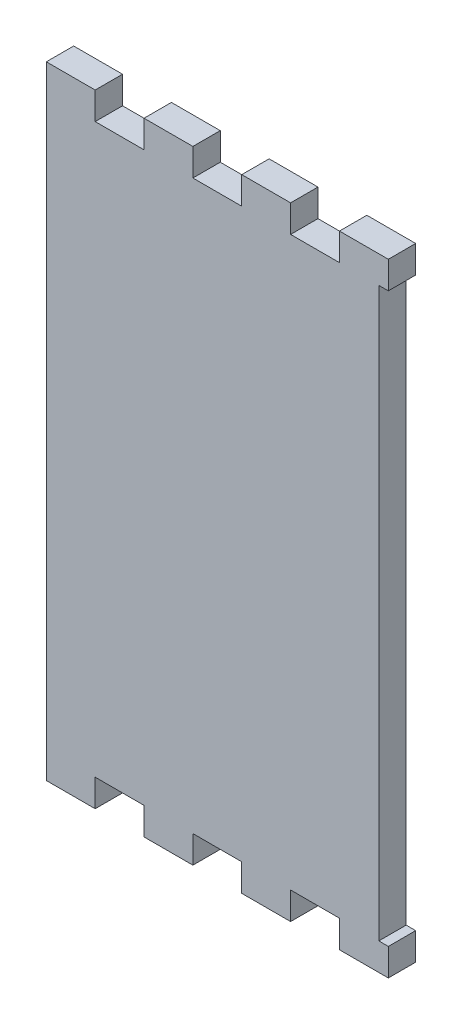
ISO-10303-21;
HEADER;
FILE_DESCRIPTION(('STEP AP214'),'2;1');
FILE_NAME('part.step','',(''),(''),'','','');
FILE_SCHEMA(('AUTOMOTIVE_DESIGN { 1 0 10303 214 1 1 1 1 }'));
ENDSEC;
DATA;
#1=APPLICATION_CONTEXT('core data for automotive mechanical design processes');
#2=APPLICATION_PROTOCOL_DEFINITION('international standard','automotive_design',2000,#1);
#3=PRODUCT_CONTEXT('',#1,'mechanical');
#4=PRODUCT('Part','Part','',(#3));
#5=PRODUCT_RELATED_PRODUCT_CATEGORY('part','',(#4));
#6=PRODUCT_DEFINITION_FORMATION('','',#4);
#7=PRODUCT_DEFINITION_CONTEXT('part definition',#1,'design');
#8=PRODUCT_DEFINITION('design','',#6,#7);
#9=PRODUCT_DEFINITION_SHAPE('','',#8);
#10=(LENGTH_UNIT() NAMED_UNIT(*) SI_UNIT(.MILLI.,.METRE.));
#11=(NAMED_UNIT(*) PLANE_ANGLE_UNIT() SI_UNIT($,.RADIAN.));
#12=(NAMED_UNIT(*) SI_UNIT($,.STERADIAN.) SOLID_ANGLE_UNIT());
#13=UNCERTAINTY_MEASURE_WITH_UNIT(LENGTH_MEASURE(1.E-05),#10,'distance_accuracy_value','');
#14=(GEOMETRIC_REPRESENTATION_CONTEXT(3) GLOBAL_UNCERTAINTY_ASSIGNED_CONTEXT((#13)) GLOBAL_UNIT_ASSIGNED_CONTEXT((#10,
#11,#12)) REPRESENTATION_CONTEXT('',''));
#15=CARTESIAN_POINT('',(0.,0.,0.));
#16=DIRECTION('',(0.,0.,1.));
#17=DIRECTION('',(1.,0.,0.));
#18=AXIS2_PLACEMENT_3D('',#15,#16,#17);
#19=CARTESIAN_POINT('',(61.2512678289989,12.8931544247676,-71.1104050028956));
#20=DIRECTION('',(1.,0.,0.));
#21=DIRECTION('',(0.,0.,-1.));
#22=AXIS2_PLACEMENT_3D('',#19,#20,#21);
#23=PLANE('',#22);
#24=DIRECTION('',(0.,-1.,0.));
#25=VECTOR('',#24,1.);
#26=CARTESIAN_POINT('',(61.2512678289989,12.8931544247676,-76.7104050028956));
#27=LINE('',#26,#25);
#28=CARTESIAN_POINT('',(61.2512678289989,134.693154424768,-76.7104050028956));
#29=VERTEX_POINT('',#28);
#30=CARTESIAN_POINT('',(61.2512678289989,7.29315442476763,-76.7104050028956));
#31=VERTEX_POINT('',#30);
#32=EDGE_CURVE('E157',#29,#31,#27,.T.);
#33=ORIENTED_EDGE('',*,*,#32,.T.);
#34=DIRECTION('',(0.,0.,-1.));
#35=VECTOR('',#34,1.);
#36=CARTESIAN_POINT('',(61.2512678289989,7.29315442476763,-71.1104050028956));
#37=LINE('',#36,#35);
#38=CARTESIAN_POINT('',(61.2512678289989,7.29315442476763,-71.1104050028956));
#39=VERTEX_POINT('',#38);
#40=EDGE_CURVE('E11',#39,#31,#37,.T.);
#41=ORIENTED_EDGE('',*,*,#40,.F.);
#42=DIRECTION('',(0.,-1.,0.));
#43=VECTOR('',#42,1.);
#44=CARTESIAN_POINT('',(61.2512678289989,134.693154424768,-71.1104050028956));
#45=LINE('',#44,#43);
#46=CARTESIAN_POINT('',(61.2512678289989,134.693154424768,-71.1104050028956));
#47=VERTEX_POINT('',#46);
#48=EDGE_CURVE('E163',#47,#39,#45,.T.);
#49=ORIENTED_EDGE('',*,*,#48,.F.);
#50=DIRECTION('',(0.,0.,-1.));
#51=VECTOR('',#50,1.);
#52=CARTESIAN_POINT('',(61.2512678289989,134.693154424768,-71.1104050028956));
#53=LINE('',#52,#51);
#54=EDGE_CURVE('E269',#47,#29,#53,.T.);
#55=ORIENTED_EDGE('',*,*,#54,.T.);
#56=EDGE_LOOP('',(#33,#41,#49,#55));
#57=FACE_BOUND('',#56,.T.);
#58=ADVANCED_FACE('F33',(#57),#23,.F.);
#59=CARTESIAN_POINT('',(61.2512678289989,7.29315442476763,-71.1104050028956));
#60=DIRECTION('',(0.,1.,0.));
#61=DIRECTION('',(0.,0.,1.));
#62=AXIS2_PLACEMENT_3D('',#59,#60,#61);
#63=PLANE('',#62);
#64=DIRECTION('',(1.,0.,0.));
#65=VECTOR('',#64,1.);
#66=CARTESIAN_POINT('',(61.2512678289989,7.29315442476763,-76.7104050028956));
#67=LINE('',#66,#65);
#68=CARTESIAN_POINT('',(71.2512678289989,7.29315442476763,-76.7104050028956));
#69=VERTEX_POINT('',#68);
#70=EDGE_CURVE('E274',#31,#69,#67,.T.);
#71=ORIENTED_EDGE('',*,*,#70,.T.);
#72=DIRECTION('',(0.,0.,-1.));
#73=VECTOR('',#72,1.);
#74=CARTESIAN_POINT('',(71.2512678289989,7.29315442476763,-71.1104050028956));
#75=LINE('',#74,#73);
#76=CARTESIAN_POINT('',(71.2512678289989,7.29315442476763,-71.1104050028956));
#77=VERTEX_POINT('',#76);
#78=EDGE_CURVE('E41',#77,#69,#75,.T.);
#79=ORIENTED_EDGE('',*,*,#78,.F.);
#80=DIRECTION('',(1.,0.,0.));
#81=VECTOR('',#80,1.);
#82=CARTESIAN_POINT('',(61.2512678289989,7.29315442476763,-71.1104050028956));
#83=LINE('',#82,#81);
#84=EDGE_CURVE('E502',#39,#77,#83,.T.);
#85=ORIENTED_EDGE('',*,*,#84,.F.);
#86=ORIENTED_EDGE('',*,*,#40,.T.);
#87=EDGE_LOOP('',(#71,#79,#85,#86));
#88=FACE_BOUND('',#87,.T.);
#89=ADVANCED_FACE('F505',(#88),#63,.F.);
#90=CARTESIAN_POINT('',(71.2512678289989,7.29315442476763,-71.1104050028956));
#91=DIRECTION('',(-1.,0.,0.));
#92=DIRECTION('',(0.,0.,1.));
#93=AXIS2_PLACEMENT_3D('',#90,#91,#92);
#94=PLANE('',#93);
#95=DIRECTION('',(0.,1.,0.));
#96=VECTOR('',#95,1.);
#97=CARTESIAN_POINT('',(71.2512678289989,7.29315442476763,-76.7104050028956));
#98=LINE('',#97,#96);
#99=CARTESIAN_POINT('',(71.2512678289989,12.8931544247676,-76.7104050028956));
#100=VERTEX_POINT('',#99);
#101=EDGE_CURVE('E276',#69,#100,#98,.T.);
#102=ORIENTED_EDGE('',*,*,#101,.T.);
#103=DIRECTION('',(0.,0.,-1.));
#104=VECTOR('',#103,1.);
#105=CARTESIAN_POINT('',(71.2512678289989,12.8931544247676,-71.1104050028956));
#106=LINE('',#105,#104);
#107=CARTESIAN_POINT('',(71.2512678289989,12.8931544247676,-71.1104050028956));
#108=VERTEX_POINT('',#107);
#109=EDGE_CURVE('E413',#108,#100,#106,.T.);
#110=ORIENTED_EDGE('',*,*,#109,.F.);
#111=DIRECTION('',(0.,1.,0.));
#112=VECTOR('',#111,1.);
#113=CARTESIAN_POINT('',(71.2512678289989,7.29315442476763,-71.1104050028956));
#114=LINE('',#113,#112);
#115=EDGE_CURVE('E422',#77,#108,#114,.T.);
#116=ORIENTED_EDGE('',*,*,#115,.F.);
#117=ORIENTED_EDGE('',*,*,#78,.T.);
#118=EDGE_LOOP('',(#102,#110,#116,#117));
#119=FACE_BOUND('',#118,.T.);
#120=ADVANCED_FACE('F420',(#119),#94,.F.);
#121=CARTESIAN_POINT('',(71.2512678289989,12.8931544247676,-71.1104050028956));
#122=DIRECTION('',(0.,1.,0.));
#123=DIRECTION('',(0.,0.,1.));
#124=AXIS2_PLACEMENT_3D('',#121,#122,#123);
#125=PLANE('',#124);
#126=DIRECTION('',(1.,0.,0.));
#127=VECTOR('',#126,1.);
#128=CARTESIAN_POINT('',(71.2512678289989,12.8931544247676,-76.7104050028956));
#129=LINE('',#128,#127);
#130=CARTESIAN_POINT('',(81.2512678289989,12.8931544247676,-76.7104050028956));
#131=VERTEX_POINT('',#130);
#132=EDGE_CURVE('E278',#100,#131,#129,.T.);
#133=ORIENTED_EDGE('',*,*,#132,.T.);
#134=DIRECTION('',(0.,0.,-1.));
#135=VECTOR('',#134,1.);
#136=CARTESIAN_POINT('',(81.2512678289989,12.8931544247676,-71.1104050028956));
#137=LINE('',#136,#135);
#138=CARTESIAN_POINT('',(81.2512678289989,12.8931544247676,-71.1104050028956));
#139=VERTEX_POINT('',#138);
#140=EDGE_CURVE('E410',#139,#131,#137,.T.);
#141=ORIENTED_EDGE('',*,*,#140,.F.);
#142=DIRECTION('',(1.,0.,0.));
#143=VECTOR('',#142,1.);
#144=CARTESIAN_POINT('',(71.2512678289989,12.8931544247676,-71.1104050028956));
#145=LINE('',#144,#143);
#146=EDGE_CURVE('E440',#108,#139,#145,.T.);
#147=ORIENTED_EDGE('',*,*,#146,.F.);
#148=ORIENTED_EDGE('',*,*,#109,.T.);
#149=EDGE_LOOP('',(#133,#141,#147,#148));
#150=FACE_BOUND('',#149,.T.);
#151=ADVANCED_FACE('F431',(#150),#125,.F.);
#152=CARTESIAN_POINT('',(81.2512678289989,12.8931544247676,-71.1104050028956));
#153=DIRECTION('',(1.,0.,0.));
#154=DIRECTION('',(0.,0.,-1.));
#155=AXIS2_PLACEMENT_3D('',#152,#153,#154);
#156=PLANE('',#155);
#157=DIRECTION('',(0.,-1.,0.));
#158=VECTOR('',#157,1.);
#159=CARTESIAN_POINT('',(81.2512678289989,12.8931544247676,-76.7104050028956));
#160=LINE('',#159,#158);
#161=CARTESIAN_POINT('',(81.2512678289989,7.29315442476763,-76.7104050028956));
#162=VERTEX_POINT('',#161);
#163=EDGE_CURVE('E280',#131,#162,#160,.T.);
#164=ORIENTED_EDGE('',*,*,#163,.T.);
#165=DIRECTION('',(0.,0.,-1.));
#166=VECTOR('',#165,1.);
#167=CARTESIAN_POINT('',(81.2512678289989,7.29315442476763,-71.1104050028956));
#168=LINE('',#167,#166);
#169=CARTESIAN_POINT('',(81.2512678289989,7.29315442476763,-71.1104050028956));
#170=VERTEX_POINT('',#169);
#171=EDGE_CURVE('E407',#170,#162,#168,.T.);
#172=ORIENTED_EDGE('',*,*,#171,.F.);
#173=DIRECTION('',(0.,-1.,0.));
#174=VECTOR('',#173,1.);
#175=CARTESIAN_POINT('',(81.2512678289989,12.8931544247676,-71.1104050028956));
#176=LINE('',#175,#174);
#177=EDGE_CURVE('E437',#139,#170,#176,.T.);
#178=ORIENTED_EDGE('',*,*,#177,.F.);
#179=ORIENTED_EDGE('',*,*,#140,.T.);
#180=EDGE_LOOP('',(#164,#172,#178,#179));
#181=FACE_BOUND('',#180,.T.);
#182=ADVANCED_FACE('F435',(#181),#156,.F.);
#183=CARTESIAN_POINT('',(81.2512678289989,7.29315442476763,-71.1104050028956));
#184=DIRECTION('',(0.,1.,0.));
#185=DIRECTION('',(0.,0.,1.));
#186=AXIS2_PLACEMENT_3D('',#183,#184,#185);
#187=PLANE('',#186);
#188=DIRECTION('',(1.,0.,0.));
#189=VECTOR('',#188,1.);
#190=CARTESIAN_POINT('',(81.2512678289989,7.29315442476763,-76.7104050028956));
#191=LINE('',#190,#189);
#192=CARTESIAN_POINT('',(91.2512678289989,7.29315442476763,-76.7104050028956));
#193=VERTEX_POINT('',#192);
#194=EDGE_CURVE('E282',#162,#193,#191,.T.);
#195=ORIENTED_EDGE('',*,*,#194,.T.);
#196=DIRECTION('',(0.,0.,-1.));
#197=VECTOR('',#196,1.);
#198=CARTESIAN_POINT('',(91.2512678289989,7.29315442476763,-71.1104050028956));
#199=LINE('',#198,#197);
#200=CARTESIAN_POINT('',(91.2512678289989,7.29315442476763,-71.1104050028956));
#201=VERTEX_POINT('',#200);
#202=EDGE_CURVE('E404',#201,#193,#199,.T.);
#203=ORIENTED_EDGE('',*,*,#202,.F.);
#204=DIRECTION('',(1.,0.,0.));
#205=VECTOR('',#204,1.);
#206=CARTESIAN_POINT('',(81.2512678289989,7.29315442476763,-71.1104050028956));
#207=LINE('',#206,#205);
#208=EDGE_CURVE('E439',#170,#201,#207,.T.);
#209=ORIENTED_EDGE('',*,*,#208,.F.);
#210=ORIENTED_EDGE('',*,*,#171,.T.);
#211=EDGE_LOOP('',(#195,#203,#209,#210));
#212=FACE_BOUND('',#211,.T.);
#213=ADVANCED_FACE('F517',(#212),#187,.F.);
#214=CARTESIAN_POINT('',(91.2512678289989,7.29315442476763,-71.1104050028956));
#215=DIRECTION('',(-1.,0.,0.));
#216=DIRECTION('',(0.,0.,1.));
#217=AXIS2_PLACEMENT_3D('',#214,#215,#216);
#218=PLANE('',#217);
#219=DIRECTION('',(0.,1.,0.));
#220=VECTOR('',#219,1.);
#221=CARTESIAN_POINT('',(91.2512678289989,7.29315442476763,-76.7104050028956));
#222=LINE('',#221,#220);
#223=CARTESIAN_POINT('',(91.2512678289989,12.8931544247676,-76.7104050028956));
#224=VERTEX_POINT('',#223);
#225=EDGE_CURVE('E284',#193,#224,#222,.T.);
#226=ORIENTED_EDGE('',*,*,#225,.T.);
#227=DIRECTION('',(0.,0.,-1.));
#228=VECTOR('',#227,1.);
#229=CARTESIAN_POINT('',(91.2512678289989,12.8931544247676,-71.1104050028956));
#230=LINE('',#229,#228);
#231=CARTESIAN_POINT('',(91.2512678289989,12.8931544247676,-71.1104050028956));
#232=VERTEX_POINT('',#231);
#233=EDGE_CURVE('E401',#232,#224,#230,.T.);
#234=ORIENTED_EDGE('',*,*,#233,.F.);
#235=DIRECTION('',(0.,1.,0.));
#236=VECTOR('',#235,1.);
#237=CARTESIAN_POINT('',(91.2512678289989,7.29315442476763,-71.1104050028956));
#238=LINE('',#237,#236);
#239=EDGE_CURVE('E442',#201,#232,#238,.T.);
#240=ORIENTED_EDGE('',*,*,#239,.F.);
#241=ORIENTED_EDGE('',*,*,#202,.T.);
#242=EDGE_LOOP('',(#226,#234,#240,#241));
#243=FACE_BOUND('',#242,.T.);
#244=ADVANCED_FACE('F520',(#243),#218,.F.);
#245=CARTESIAN_POINT('',(91.2512678289989,12.8931544247676,-71.1104050028956));
#246=DIRECTION('',(0.,1.,0.));
#247=DIRECTION('',(0.,0.,1.));
#248=AXIS2_PLACEMENT_3D('',#245,#246,#247);
#249=PLANE('',#248);
#250=DIRECTION('',(1.,0.,0.));
#251=VECTOR('',#250,1.);
#252=CARTESIAN_POINT('',(91.2512678289989,12.8931544247676,-76.7104050028956));
#253=LINE('',#252,#251);
#254=CARTESIAN_POINT('',(101.251267828999,12.8931544247676,-76.7104050028956));
#255=VERTEX_POINT('',#254);
#256=EDGE_CURVE('E286',#224,#255,#253,.T.);
#257=ORIENTED_EDGE('',*,*,#256,.T.);
#258=DIRECTION('',(0.,0.,-1.));
#259=VECTOR('',#258,1.);
#260=CARTESIAN_POINT('',(101.251267828999,12.8931544247676,-71.1104050028956));
#261=LINE('',#260,#259);
#262=CARTESIAN_POINT('',(101.251267828999,12.8931544247676,-71.1104050028956));
#263=VERTEX_POINT('',#262);
#264=EDGE_CURVE('E398',#263,#255,#261,.T.);
#265=ORIENTED_EDGE('',*,*,#264,.F.);
#266=DIRECTION('',(1.,0.,0.));
#267=VECTOR('',#266,1.);
#268=CARTESIAN_POINT('',(91.2512678289989,12.8931544247676,-71.1104050028956));
#269=LINE('',#268,#267);
#270=EDGE_CURVE('E448',#232,#263,#269,.T.);
#271=ORIENTED_EDGE('',*,*,#270,.F.);
#272=ORIENTED_EDGE('',*,*,#233,.T.);
#273=EDGE_LOOP('',(#257,#265,#271,#272));
#274=FACE_BOUND('',#273,.T.);
#275=ADVANCED_FACE('F524',(#274),#249,.F.);
#276=CARTESIAN_POINT('',(101.251267828999,12.8931544247676,-71.1104050028956));
#277=DIRECTION('',(1.,0.,0.));
#278=DIRECTION('',(0.,0.,-1.));
#279=AXIS2_PLACEMENT_3D('',#276,#277,#278);
#280=PLANE('',#279);
#281=DIRECTION('',(0.,-1.,0.));
#282=VECTOR('',#281,1.);
#283=CARTESIAN_POINT('',(101.251267828999,12.8931544247676,-76.7104050028956));
#284=LINE('',#283,#282);
#285=CARTESIAN_POINT('',(101.251267828999,7.29315442476763,-76.7104050028956));
#286=VERTEX_POINT('',#285);
#287=EDGE_CURVE('E288',#255,#286,#284,.T.);
#288=ORIENTED_EDGE('',*,*,#287,.T.);
#289=DIRECTION('',(0.,0.,-1.));
#290=VECTOR('',#289,1.);
#291=CARTESIAN_POINT('',(101.251267828999,7.29315442476763,-71.1104050028956));
#292=LINE('',#291,#290);
#293=CARTESIAN_POINT('',(101.251267828999,7.29315442476763,-71.1104050028956));
#294=VERTEX_POINT('',#293);
#295=EDGE_CURVE('E395',#294,#286,#292,.T.);
#296=ORIENTED_EDGE('',*,*,#295,.F.);
#297=DIRECTION('',(0.,-1.,0.));
#298=VECTOR('',#297,1.);
#299=CARTESIAN_POINT('',(101.251267828999,12.8931544247676,-71.1104050028956));
#300=LINE('',#299,#298);
#301=EDGE_CURVE('E450',#263,#294,#300,.T.);
#302=ORIENTED_EDGE('',*,*,#301,.F.);
#303=ORIENTED_EDGE('',*,*,#264,.T.);
#304=EDGE_LOOP('',(#288,#296,#302,#303));
#305=FACE_BOUND('',#304,.T.);
#306=ADVANCED_FACE('F528',(#305),#280,.F.);
#307=CARTESIAN_POINT('',(101.251267828999,7.29315442476763,-71.1104050028956));
#308=DIRECTION('',(0.,1.,0.));
#309=DIRECTION('',(0.,0.,1.));
#310=AXIS2_PLACEMENT_3D('',#307,#308,#309);
#311=PLANE('',#310);
#312=DIRECTION('',(1.,0.,0.));
#313=VECTOR('',#312,1.);
#314=CARTESIAN_POINT('',(101.251267828999,7.29315442476763,-76.7104050028956));
#315=LINE('',#314,#313);
#316=CARTESIAN_POINT('',(111.251267828999,7.29315442476763,-76.7104050028956));
#317=VERTEX_POINT('',#316);
#318=EDGE_CURVE('E290',#286,#317,#315,.T.);
#319=ORIENTED_EDGE('',*,*,#318,.T.);
#320=DIRECTION('',(0.,0.,-1.));
#321=VECTOR('',#320,1.);
#322=CARTESIAN_POINT('',(111.251267828999,7.29315442476763,-71.1104050028956));
#323=LINE('',#322,#321);
#324=CARTESIAN_POINT('',(111.251267828999,7.29315442476763,-71.1104050028956));
#325=VERTEX_POINT('',#324);
#326=EDGE_CURVE('E392',#325,#317,#323,.T.);
#327=ORIENTED_EDGE('',*,*,#326,.F.);
#328=DIRECTION('',(1.,0.,0.));
#329=VECTOR('',#328,1.);
#330=CARTESIAN_POINT('',(101.251267828999,7.29315442476763,-71.1104050028956));
#331=LINE('',#330,#329);
#332=EDGE_CURVE('E452',#294,#325,#331,.T.);
#333=ORIENTED_EDGE('',*,*,#332,.F.);
#334=ORIENTED_EDGE('',*,*,#295,.T.);
#335=EDGE_LOOP('',(#319,#327,#333,#334));
#336=FACE_BOUND('',#335,.T.);
#337=ADVANCED_FACE('F532',(#336),#311,.F.);
#338=CARTESIAN_POINT('',(111.251267828999,7.29315442476763,-71.1104050028956));
#339=DIRECTION('',(-1.,0.,0.));
#340=DIRECTION('',(0.,0.,1.));
#341=AXIS2_PLACEMENT_3D('',#338,#339,#340);
#342=PLANE('',#341);
#343=DIRECTION('',(0.,1.,0.));
#344=VECTOR('',#343,1.);
#345=CARTESIAN_POINT('',(111.251267828999,7.29315442476763,-76.7104050028956));
#346=LINE('',#345,#344);
#347=CARTESIAN_POINT('',(111.251267828999,12.8931544247676,-76.7104050028956));
#348=VERTEX_POINT('',#347);
#349=EDGE_CURVE('E292',#317,#348,#346,.T.);
#350=ORIENTED_EDGE('',*,*,#349,.T.);
#351=DIRECTION('',(0.,0.,-1.));
#352=VECTOR('',#351,1.);
#353=CARTESIAN_POINT('',(111.251267828999,12.8931544247676,-71.1104050028956));
#354=LINE('',#353,#352);
#355=CARTESIAN_POINT('',(111.251267828999,12.8931544247676,-71.1104050028956));
#356=VERTEX_POINT('',#355);
#357=EDGE_CURVE('E389',#356,#348,#354,.T.);
#358=ORIENTED_EDGE('',*,*,#357,.F.);
#359=DIRECTION('',(0.,1.,0.));
#360=VECTOR('',#359,1.);
#361=CARTESIAN_POINT('',(111.251267828999,7.29315442476763,-71.1104050028956));
#362=LINE('',#361,#360);
#363=EDGE_CURVE('E454',#325,#356,#362,.T.);
#364=ORIENTED_EDGE('',*,*,#363,.F.);
#365=ORIENTED_EDGE('',*,*,#326,.T.);
#366=EDGE_LOOP('',(#350,#358,#364,#365));
#367=FACE_BOUND('',#366,.T.);
#368=ADVANCED_FACE('F536',(#367),#342,.F.);
#369=CARTESIAN_POINT('',(111.251267828999,12.8931544247676,-71.1104050028956));
#370=DIRECTION('',(0.,1.,0.));
#371=DIRECTION('',(0.,0.,1.));
#372=AXIS2_PLACEMENT_3D('',#369,#370,#371);
#373=PLANE('',#372);
#374=DIRECTION('',(1.,0.,0.));
#375=VECTOR('',#374,1.);
#376=CARTESIAN_POINT('',(111.251267828999,12.8931544247676,-76.7104050028956));
#377=LINE('',#376,#375);
#378=CARTESIAN_POINT('',(121.251267828999,12.8931544247676,-76.7104050028956));
#379=VERTEX_POINT('',#378);
#380=EDGE_CURVE('E294',#348,#379,#377,.T.);
#381=ORIENTED_EDGE('',*,*,#380,.T.);
#382=DIRECTION('',(0.,0.,-1.));
#383=VECTOR('',#382,1.);
#384=CARTESIAN_POINT('',(121.251267828999,12.8931544247676,-71.1104050028956));
#385=LINE('',#384,#383);
#386=CARTESIAN_POINT('',(121.251267828999,12.8931544247676,-71.1104050028956));
#387=VERTEX_POINT('',#386);
#388=EDGE_CURVE('E386',#387,#379,#385,.T.);
#389=ORIENTED_EDGE('',*,*,#388,.F.);
#390=DIRECTION('',(1.,0.,0.));
#391=VECTOR('',#390,1.);
#392=CARTESIAN_POINT('',(111.251267828999,12.8931544247676,-71.1104050028956));
#393=LINE('',#392,#391);
#394=EDGE_CURVE('E456',#356,#387,#393,.T.);
#395=ORIENTED_EDGE('',*,*,#394,.F.);
#396=ORIENTED_EDGE('',*,*,#357,.T.);
#397=EDGE_LOOP('',(#381,#389,#395,#396));
#398=FACE_BOUND('',#397,.T.);
#399=ADVANCED_FACE('F540',(#398),#373,.F.);
#400=CARTESIAN_POINT('',(121.251267828999,12.8931544247676,-71.1104050028956));
#401=DIRECTION('',(1.,0.,0.));
#402=DIRECTION('',(0.,0.,-1.));
#403=AXIS2_PLACEMENT_3D('',#400,#401,#402);
#404=PLANE('',#403);
#405=DIRECTION('',(0.,-1.,0.));
#406=VECTOR('',#405,1.);
#407=CARTESIAN_POINT('',(121.251267828999,12.8931544247676,-76.7104050028956));
#408=LINE('',#407,#406);
#409=CARTESIAN_POINT('',(121.251267828999,7.29315442476763,-76.7104050028956));
#410=VERTEX_POINT('',#409);
#411=EDGE_CURVE('E296',#379,#410,#408,.T.);
#412=ORIENTED_EDGE('',*,*,#411,.T.);
#413=DIRECTION('',(0.,0.,-1.));
#414=VECTOR('',#413,1.);
#415=CARTESIAN_POINT('',(121.251267828999,7.29315442476763,-71.1104050028956));
#416=LINE('',#415,#414);
#417=CARTESIAN_POINT('',(121.251267828999,7.29315442476763,-71.1104050028956));
#418=VERTEX_POINT('',#417);
#419=EDGE_CURVE('E383',#418,#410,#416,.T.);
#420=ORIENTED_EDGE('',*,*,#419,.F.);
#421=DIRECTION('',(0.,-1.,0.));
#422=VECTOR('',#421,1.);
#423=CARTESIAN_POINT('',(121.251267828999,12.8931544247676,-71.1104050028956));
#424=LINE('',#423,#422);
#425=EDGE_CURVE('E458',#387,#418,#424,.T.);
#426=ORIENTED_EDGE('',*,*,#425,.F.);
#427=ORIENTED_EDGE('',*,*,#388,.T.);
#428=EDGE_LOOP('',(#412,#420,#426,#427));
#429=FACE_BOUND('',#428,.T.);
#430=ADVANCED_FACE('F544',(#429),#404,.F.);
#431=CARTESIAN_POINT('',(121.251267828999,7.29315442476763,-71.1104050028956));
#432=DIRECTION('',(0.,1.,0.));
#433=DIRECTION('',(0.,0.,1.));
#434=AXIS2_PLACEMENT_3D('',#431,#432,#433);
#435=PLANE('',#434);
#436=DIRECTION('',(1.,0.,0.));
#437=VECTOR('',#436,1.);
#438=CARTESIAN_POINT('',(121.251267828999,7.29315442476763,-76.7104050028956));
#439=LINE('',#438,#437);
#440=CARTESIAN_POINT('',(131.251267828999,7.29315442476763,-76.7104050028956));
#441=VERTEX_POINT('',#440);
#442=EDGE_CURVE('E298',#410,#441,#439,.T.);
#443=ORIENTED_EDGE('',*,*,#442,.T.);
#444=DIRECTION('',(0.,0.,-1.));
#445=VECTOR('',#444,1.);
#446=CARTESIAN_POINT('',(131.251267828999,7.29315442476763,-71.1104050028956));
#447=LINE('',#446,#445);
#448=CARTESIAN_POINT('',(131.251267828999,7.29315442476763,-71.1104050028956));
#449=VERTEX_POINT('',#448);
#450=EDGE_CURVE('E380',#449,#441,#447,.T.);
#451=ORIENTED_EDGE('',*,*,#450,.F.);
#452=DIRECTION('',(1.,0.,0.));
#453=VECTOR('',#452,1.);
#454=CARTESIAN_POINT('',(121.251267828999,7.29315442476763,-71.1104050028956));
#455=LINE('',#454,#453);
#456=EDGE_CURVE('E460',#418,#449,#455,.T.);
#457=ORIENTED_EDGE('',*,*,#456,.F.);
#458=ORIENTED_EDGE('',*,*,#419,.T.);
#459=EDGE_LOOP('',(#443,#451,#457,#458));
#460=FACE_BOUND('',#459,.T.);
#461=ADVANCED_FACE('F548',(#460),#435,.F.);
#462=CARTESIAN_POINT('',(131.251267828999,7.29315442476763,-71.1104050028956));
#463=DIRECTION('',(-1.,0.,0.));
#464=DIRECTION('',(0.,0.,1.));
#465=AXIS2_PLACEMENT_3D('',#462,#463,#464);
#466=PLANE('',#465);
#467=DIRECTION('',(0.,1.,0.));
#468=VECTOR('',#467,1.);
#469=CARTESIAN_POINT('',(131.251267828999,7.29315442476763,-76.7104050028956));
#470=LINE('',#469,#468);
#471=CARTESIAN_POINT('',(131.251267828999,12.8931544247676,-76.7104050028956));
#472=VERTEX_POINT('',#471);
#473=EDGE_CURVE('E300',#441,#472,#470,.T.);
#474=ORIENTED_EDGE('',*,*,#473,.T.);
#475=DIRECTION('',(0.,0.,-1.));
#476=VECTOR('',#475,1.);
#477=CARTESIAN_POINT('',(131.251267828999,12.8931544247676,-71.1104050028956));
#478=LINE('',#477,#476);
#479=CARTESIAN_POINT('',(131.251267828999,12.8931544247676,-71.1104050028956));
#480=VERTEX_POINT('',#479);
#481=EDGE_CURVE('E377',#480,#472,#478,.T.);
#482=ORIENTED_EDGE('',*,*,#481,.F.);
#483=DIRECTION('',(0.,1.,0.));
#484=VECTOR('',#483,1.);
#485=CARTESIAN_POINT('',(131.251267828999,7.29315442476763,-71.1104050028956));
#486=LINE('',#485,#484);
#487=EDGE_CURVE('E462',#449,#480,#486,.T.);
#488=ORIENTED_EDGE('',*,*,#487,.F.);
#489=ORIENTED_EDGE('',*,*,#450,.T.);
#490=EDGE_LOOP('',(#474,#482,#488,#489));
#491=FACE_BOUND('',#490,.T.);
#492=ADVANCED_FACE('F552',(#491),#466,.F.);
#493=CARTESIAN_POINT('',(131.251267828999,12.8931544247676,-71.1104050028956));
#494=DIRECTION('',(0.,-1.,0.));
#495=DIRECTION('',(0.,0.,-1.));
#496=AXIS2_PLACEMENT_3D('',#493,#494,#495);
#497=PLANE('',#496);
#498=DIRECTION('',(-1.,0.,0.));
#499=VECTOR('',#498,1.);
#500=CARTESIAN_POINT('',(131.251267828999,12.8931544247676,-76.7104050028956));
#501=LINE('',#500,#499);
#502=CARTESIAN_POINT('',(129.305687175353,12.8931544247676,-76.7104050028956));
#503=VERTEX_POINT('',#502);
#504=EDGE_CURVE('E302',#472,#503,#501,.T.);
#505=ORIENTED_EDGE('',*,*,#504,.T.);
#506=DIRECTION('',(0.,0.,-1.));
#507=VECTOR('',#506,1.);
#508=CARTESIAN_POINT('',(129.305687175353,12.8931544247676,-71.1104050028956));
#509=LINE('',#508,#507);
#510=CARTESIAN_POINT('',(129.305687175353,12.8931544247676,-71.1104050028956));
#511=VERTEX_POINT('',#510);
#512=EDGE_CURVE('E374',#511,#503,#509,.T.);
#513=ORIENTED_EDGE('',*,*,#512,.F.);
#514=DIRECTION('',(-1.,0.,0.));
#515=VECTOR('',#514,1.);
#516=CARTESIAN_POINT('',(131.251267828999,12.8931544247676,-71.1104050028956));
#517=LINE('',#516,#515);
#518=EDGE_CURVE('E464',#480,#511,#517,.T.);
#519=ORIENTED_EDGE('',*,*,#518,.F.);
#520=ORIENTED_EDGE('',*,*,#481,.T.);
#521=EDGE_LOOP('',(#505,#513,#519,#520));
#522=FACE_BOUND('',#521,.T.);
#523=ADVANCED_FACE('F556',(#522),#497,.F.);
#524=CARTESIAN_POINT('',(129.305687175353,129.093154424768,-71.1104050028956));
#525=DIRECTION('',(-1.,0.,0.));
#526=DIRECTION('',(0.,0.,1.));
#527=AXIS2_PLACEMENT_3D('',#524,#525,#526);
#528=PLANE('',#527);
#529=DIRECTION('',(0.,1.,0.));
#530=VECTOR('',#529,1.);
#531=CARTESIAN_POINT('',(129.305687175353,129.093154424768,-76.7104050028956));
#532=LINE('',#531,#530);
#533=CARTESIAN_POINT('',(129.305687175353,129.093154424768,-76.7104050028956));
#534=VERTEX_POINT('',#533);
#535=EDGE_CURVE('E304',#503,#534,#532,.T.);
#536=ORIENTED_EDGE('',*,*,#535,.T.);
#537=DIRECTION('',(0.,0.,-1.));
#538=VECTOR('',#537,1.);
#539=CARTESIAN_POINT('',(129.305687175353,129.093154424768,-71.1104050028956));
#540=LINE('',#539,#538);
#541=CARTESIAN_POINT('',(129.305687175353,129.093154424768,-71.1104050028956));
#542=VERTEX_POINT('',#541);
#543=EDGE_CURVE('E371',#542,#534,#540,.T.);
#544=ORIENTED_EDGE('',*,*,#543,.F.);
#545=DIRECTION('',(0.,1.,0.));
#546=VECTOR('',#545,1.);
#547=CARTESIAN_POINT('',(129.305687175353,129.093154424768,-71.1104050028956));
#548=LINE('',#547,#546);
#549=EDGE_CURVE('E466',#511,#542,#548,.T.);
#550=ORIENTED_EDGE('',*,*,#549,.F.);
#551=ORIENTED_EDGE('',*,*,#512,.T.);
#552=EDGE_LOOP('',(#536,#544,#550,#551));
#553=FACE_BOUND('',#552,.T.);
#554=ADVANCED_FACE('F560',(#553),#528,.F.);
#555=CARTESIAN_POINT('',(129.305687175353,129.093154424768,-71.1104050028956));
#556=DIRECTION('',(0.,1.,0.));
#557=DIRECTION('',(0.,0.,1.));
#558=AXIS2_PLACEMENT_3D('',#555,#556,#557);
#559=PLANE('',#558);
#560=DIRECTION('',(1.,0.,0.));
#561=VECTOR('',#560,1.);
#562=CARTESIAN_POINT('',(129.305687175353,129.093154424768,-76.7104050028956));
#563=LINE('',#562,#561);
#564=CARTESIAN_POINT('',(131.251267828999,129.093154424768,-76.7104050028956));
#565=VERTEX_POINT('',#564);
#566=EDGE_CURVE('E306',#534,#565,#563,.T.);
#567=ORIENTED_EDGE('',*,*,#566,.T.);
#568=DIRECTION('',(0.,0.,-1.));
#569=VECTOR('',#568,1.);
#570=CARTESIAN_POINT('',(131.251267828999,129.093154424768,-71.1104050028956));
#571=LINE('',#570,#569);
#572=CARTESIAN_POINT('',(131.251267828999,129.093154424768,-71.1104050028956));
#573=VERTEX_POINT('',#572);
#574=EDGE_CURVE('E368',#573,#565,#571,.T.);
#575=ORIENTED_EDGE('',*,*,#574,.F.);
#576=DIRECTION('',(1.,0.,0.));
#577=VECTOR('',#576,1.);
#578=CARTESIAN_POINT('',(129.305687175353,129.093154424768,-71.1104050028956));
#579=LINE('',#578,#577);
#580=EDGE_CURVE('E468',#542,#573,#579,.T.);
#581=ORIENTED_EDGE('',*,*,#580,.F.);
#582=ORIENTED_EDGE('',*,*,#543,.T.);
#583=EDGE_LOOP('',(#567,#575,#581,#582));
#584=FACE_BOUND('',#583,.T.);
#585=ADVANCED_FACE('F564',(#584),#559,.F.);
#586=CARTESIAN_POINT('',(131.251267828999,129.093154424768,-71.1104050028956));
#587=DIRECTION('',(-1.,0.,0.));
#588=DIRECTION('',(0.,0.,1.));
#589=AXIS2_PLACEMENT_3D('',#586,#587,#588);
#590=PLANE('',#589);
#591=DIRECTION('',(0.,1.,0.));
#592=VECTOR('',#591,1.);
#593=CARTESIAN_POINT('',(131.251267828999,129.093154424768,-76.7104050028956));
#594=LINE('',#593,#592);
#595=CARTESIAN_POINT('',(131.251267828999,134.693154424768,-76.7104050028956));
#596=VERTEX_POINT('',#595);
#597=EDGE_CURVE('E308',#565,#596,#594,.T.);
#598=ORIENTED_EDGE('',*,*,#597,.T.);
#599=DIRECTION('',(0.,0.,-1.));
#600=VECTOR('',#599,1.);
#601=CARTESIAN_POINT('',(131.251267828999,134.693154424768,-71.1104050028956));
#602=LINE('',#601,#600);
#603=CARTESIAN_POINT('',(131.251267828999,134.693154424768,-71.1104050028956));
#604=VERTEX_POINT('',#603);
#605=EDGE_CURVE('E365',#604,#596,#602,.T.);
#606=ORIENTED_EDGE('',*,*,#605,.F.);
#607=DIRECTION('',(0.,1.,0.));
#608=VECTOR('',#607,1.);
#609=CARTESIAN_POINT('',(131.251267828999,129.093154424768,-71.1104050028956));
#610=LINE('',#609,#608);
#611=EDGE_CURVE('E470',#573,#604,#610,.T.);
#612=ORIENTED_EDGE('',*,*,#611,.F.);
#613=ORIENTED_EDGE('',*,*,#574,.T.);
#614=EDGE_LOOP('',(#598,#606,#612,#613));
#615=FACE_BOUND('',#614,.T.);
#616=ADVANCED_FACE('F568',(#615),#590,.F.);
#617=CARTESIAN_POINT('',(131.251267828999,134.693154424768,-71.1104050028956));
#618=DIRECTION('',(0.,-1.,0.));
#619=DIRECTION('',(0.,0.,-1.));
#620=AXIS2_PLACEMENT_3D('',#617,#618,#619);
#621=PLANE('',#620);
#622=DIRECTION('',(-1.,0.,0.));
#623=VECTOR('',#622,1.);
#624=CARTESIAN_POINT('',(131.251267828999,134.693154424768,-76.7104050028956));
#625=LINE('',#624,#623);
#626=CARTESIAN_POINT('',(121.251267828999,134.693154424768,-76.7104050028956));
#627=VERTEX_POINT('',#626);
#628=EDGE_CURVE('E310',#596,#627,#625,.T.);
#629=ORIENTED_EDGE('',*,*,#628,.T.);
#630=DIRECTION('',(0.,0.,-1.));
#631=VECTOR('',#630,1.);
#632=CARTESIAN_POINT('',(121.251267828999,134.693154424768,-71.1104050028956));
#633=LINE('',#632,#631);
#634=CARTESIAN_POINT('',(121.251267828999,134.693154424768,-71.1104050028956));
#635=VERTEX_POINT('',#634);
#636=EDGE_CURVE('E362',#635,#627,#633,.T.);
#637=ORIENTED_EDGE('',*,*,#636,.F.);
#638=DIRECTION('',(-1.,0.,0.));
#639=VECTOR('',#638,1.);
#640=CARTESIAN_POINT('',(131.251267828999,134.693154424768,-71.1104050028956));
#641=LINE('',#640,#639);
#642=EDGE_CURVE('E472',#604,#635,#641,.T.);
#643=ORIENTED_EDGE('',*,*,#642,.F.);
#644=ORIENTED_EDGE('',*,*,#605,.T.);
#645=EDGE_LOOP('',(#629,#637,#643,#644));
#646=FACE_BOUND('',#645,.T.);
#647=ADVANCED_FACE('F572',(#646),#621,.F.);
#648=CARTESIAN_POINT('',(121.251267828999,134.693154424768,-71.1104050028956));
#649=DIRECTION('',(1.,0.,0.));
#650=DIRECTION('',(0.,0.,-1.));
#651=AXIS2_PLACEMENT_3D('',#648,#649,#650);
#652=PLANE('',#651);
#653=DIRECTION('',(0.,-1.,0.));
#654=VECTOR('',#653,1.);
#655=CARTESIAN_POINT('',(121.251267828999,134.693154424768,-76.7104050028956));
#656=LINE('',#655,#654);
#657=CARTESIAN_POINT('',(121.251267828999,129.093154424768,-76.7104050028956));
#658=VERTEX_POINT('',#657);
#659=EDGE_CURVE('E312',#627,#658,#656,.T.);
#660=ORIENTED_EDGE('',*,*,#659,.T.);
#661=DIRECTION('',(0.,0.,-1.));
#662=VECTOR('',#661,1.);
#663=CARTESIAN_POINT('',(121.251267828999,129.093154424768,-71.1104050028956));
#664=LINE('',#663,#662);
#665=CARTESIAN_POINT('',(121.251267828999,129.093154424768,-71.1104050028956));
#666=VERTEX_POINT('',#665);
#667=EDGE_CURVE('E359',#666,#658,#664,.T.);
#668=ORIENTED_EDGE('',*,*,#667,.F.);
#669=DIRECTION('',(0.,-1.,0.));
#670=VECTOR('',#669,1.);
#671=CARTESIAN_POINT('',(121.251267828999,134.693154424768,-71.1104050028956));
#672=LINE('',#671,#670);
#673=EDGE_CURVE('E474',#635,#666,#672,.T.);
#674=ORIENTED_EDGE('',*,*,#673,.F.);
#675=ORIENTED_EDGE('',*,*,#636,.T.);
#676=EDGE_LOOP('',(#660,#668,#674,#675));
#677=FACE_BOUND('',#676,.T.);
#678=ADVANCED_FACE('F576',(#677),#652,.F.);
#679=CARTESIAN_POINT('',(111.251267828999,129.093154424768,-71.1104050028956));
#680=DIRECTION('',(0.,-1.,0.));
#681=DIRECTION('',(0.,0.,-1.));
#682=AXIS2_PLACEMENT_3D('',#679,#680,#681);
#683=PLANE('',#682);
#684=DIRECTION('',(-1.,0.,0.));
#685=VECTOR('',#684,1.);
#686=CARTESIAN_POINT('',(111.251267828999,129.093154424768,-76.7104050028956));
#687=LINE('',#686,#685);
#688=CARTESIAN_POINT('',(111.251267828999,129.093154424768,-76.7104050028956));
#689=VERTEX_POINT('',#688);
#690=EDGE_CURVE('E314',#658,#689,#687,.T.);
#691=ORIENTED_EDGE('',*,*,#690,.T.);
#692=DIRECTION('',(0.,0.,-1.));
#693=VECTOR('',#692,1.);
#694=CARTESIAN_POINT('',(111.251267828999,129.093154424768,-71.1104050028956));
#695=LINE('',#694,#693);
#696=CARTESIAN_POINT('',(111.251267828999,129.093154424768,-71.1104050028956));
#697=VERTEX_POINT('',#696);
#698=EDGE_CURVE('E356',#697,#689,#695,.T.);
#699=ORIENTED_EDGE('',*,*,#698,.F.);
#700=DIRECTION('',(-1.,0.,0.));
#701=VECTOR('',#700,1.);
#702=CARTESIAN_POINT('',(111.251267828999,129.093154424768,-71.1104050028956));
#703=LINE('',#702,#701);
#704=EDGE_CURVE('E476',#666,#697,#703,.T.);
#705=ORIENTED_EDGE('',*,*,#704,.F.);
#706=ORIENTED_EDGE('',*,*,#667,.T.);
#707=EDGE_LOOP('',(#691,#699,#705,#706));
#708=FACE_BOUND('',#707,.T.);
#709=ADVANCED_FACE('F580',(#708),#683,.F.);
#710=CARTESIAN_POINT('',(111.251267828999,129.093154424768,-71.1104050028956));
#711=DIRECTION('',(-1.,0.,0.));
#712=DIRECTION('',(0.,0.,1.));
#713=AXIS2_PLACEMENT_3D('',#710,#711,#712);
#714=PLANE('',#713);
#715=DIRECTION('',(0.,1.,0.));
#716=VECTOR('',#715,1.);
#717=CARTESIAN_POINT('',(111.251267828999,129.093154424768,-76.7104050028956));
#718=LINE('',#717,#716);
#719=CARTESIAN_POINT('',(111.251267828999,134.693154424768,-76.7104050028956));
#720=VERTEX_POINT('',#719);
#721=EDGE_CURVE('E316',#689,#720,#718,.T.);
#722=ORIENTED_EDGE('',*,*,#721,.T.);
#723=DIRECTION('',(0.,0.,-1.));
#724=VECTOR('',#723,1.);
#725=CARTESIAN_POINT('',(111.251267828999,134.693154424768,-71.1104050028956));
#726=LINE('',#725,#724);
#727=CARTESIAN_POINT('',(111.251267828999,134.693154424768,-71.1104050028956));
#728=VERTEX_POINT('',#727);
#729=EDGE_CURVE('E353',#728,#720,#726,.T.);
#730=ORIENTED_EDGE('',*,*,#729,.F.);
#731=DIRECTION('',(0.,1.,0.));
#732=VECTOR('',#731,1.);
#733=CARTESIAN_POINT('',(111.251267828999,129.093154424768,-71.1104050028956));
#734=LINE('',#733,#732);
#735=EDGE_CURVE('E478',#697,#728,#734,.T.);
#736=ORIENTED_EDGE('',*,*,#735,.F.);
#737=ORIENTED_EDGE('',*,*,#698,.T.);
#738=EDGE_LOOP('',(#722,#730,#736,#737));
#739=FACE_BOUND('',#738,.T.);
#740=ADVANCED_FACE('F584',(#739),#714,.F.);
#741=CARTESIAN_POINT('',(111.251267828999,134.693154424768,-71.1104050028956));
#742=DIRECTION('',(0.,-1.,0.));
#743=DIRECTION('',(0.,0.,-1.));
#744=AXIS2_PLACEMENT_3D('',#741,#742,#743);
#745=PLANE('',#744);
#746=DIRECTION('',(-1.,0.,0.));
#747=VECTOR('',#746,1.);
#748=CARTESIAN_POINT('',(111.251267828999,134.693154424768,-76.7104050028956));
#749=LINE('',#748,#747);
#750=CARTESIAN_POINT('',(101.251267828999,134.693154424768,-76.7104050028956));
#751=VERTEX_POINT('',#750);
#752=EDGE_CURVE('E318',#720,#751,#749,.T.);
#753=ORIENTED_EDGE('',*,*,#752,.T.);
#754=DIRECTION('',(0.,0.,-1.));
#755=VECTOR('',#754,1.);
#756=CARTESIAN_POINT('',(101.251267828999,134.693154424768,-71.1104050028956));
#757=LINE('',#756,#755);
#758=CARTESIAN_POINT('',(101.251267828999,134.693154424768,-71.1104050028956));
#759=VERTEX_POINT('',#758);
#760=EDGE_CURVE('E350',#759,#751,#757,.T.);
#761=ORIENTED_EDGE('',*,*,#760,.F.);
#762=DIRECTION('',(-1.,0.,0.));
#763=VECTOR('',#762,1.);
#764=CARTESIAN_POINT('',(111.251267828999,134.693154424768,-71.1104050028956));
#765=LINE('',#764,#763);
#766=EDGE_CURVE('E480',#728,#759,#765,.T.);
#767=ORIENTED_EDGE('',*,*,#766,.F.);
#768=ORIENTED_EDGE('',*,*,#729,.T.);
#769=EDGE_LOOP('',(#753,#761,#767,#768));
#770=FACE_BOUND('',#769,.T.);
#771=ADVANCED_FACE('F588',(#770),#745,.F.);
#772=CARTESIAN_POINT('',(101.251267828999,134.693154424768,-71.1104050028956));
#773=DIRECTION('',(1.,0.,0.));
#774=DIRECTION('',(0.,0.,-1.));
#775=AXIS2_PLACEMENT_3D('',#772,#773,#774);
#776=PLANE('',#775);
#777=DIRECTION('',(0.,-1.,0.));
#778=VECTOR('',#777,1.);
#779=CARTESIAN_POINT('',(101.251267828999,134.693154424768,-76.7104050028956));
#780=LINE('',#779,#778);
#781=CARTESIAN_POINT('',(101.251267828999,129.093154424768,-76.7104050028956));
#782=VERTEX_POINT('',#781);
#783=EDGE_CURVE('E320',#751,#782,#780,.T.);
#784=ORIENTED_EDGE('',*,*,#783,.T.);
#785=DIRECTION('',(0.,0.,-1.));
#786=VECTOR('',#785,1.);
#787=CARTESIAN_POINT('',(101.251267828999,129.093154424768,-71.1104050028956));
#788=LINE('',#787,#786);
#789=CARTESIAN_POINT('',(101.251267828999,129.093154424768,-71.1104050028956));
#790=VERTEX_POINT('',#789);
#791=EDGE_CURVE('E347',#790,#782,#788,.T.);
#792=ORIENTED_EDGE('',*,*,#791,.F.);
#793=DIRECTION('',(0.,-1.,0.));
#794=VECTOR('',#793,1.);
#795=CARTESIAN_POINT('',(101.251267828999,134.693154424768,-71.1104050028956));
#796=LINE('',#795,#794);
#797=EDGE_CURVE('E482',#759,#790,#796,.T.);
#798=ORIENTED_EDGE('',*,*,#797,.F.);
#799=ORIENTED_EDGE('',*,*,#760,.T.);
#800=EDGE_LOOP('',(#784,#792,#798,#799));
#801=FACE_BOUND('',#800,.T.);
#802=ADVANCED_FACE('F592',(#801),#776,.F.);
#803=CARTESIAN_POINT('',(91.2512678289989,129.093154424768,-71.1104050028956));
#804=DIRECTION('',(0.,-1.,0.));
#805=DIRECTION('',(0.,0.,-1.));
#806=AXIS2_PLACEMENT_3D('',#803,#804,#805);
#807=PLANE('',#806);
#808=DIRECTION('',(-1.,0.,0.));
#809=VECTOR('',#808,1.);
#810=CARTESIAN_POINT('',(91.2512678289989,129.093154424768,-76.7104050028956));
#811=LINE('',#810,#809);
#812=CARTESIAN_POINT('',(91.2512678289989,129.093154424768,-76.7104050028956));
#813=VERTEX_POINT('',#812);
#814=EDGE_CURVE('E322',#782,#813,#811,.T.);
#815=ORIENTED_EDGE('',*,*,#814,.T.);
#816=DIRECTION('',(0.,0.,-1.));
#817=VECTOR('',#816,1.);
#818=CARTESIAN_POINT('',(91.2512678289989,129.093154424768,-71.1104050028956));
#819=LINE('',#818,#817);
#820=CARTESIAN_POINT('',(91.2512678289989,129.093154424768,-71.1104050028956));
#821=VERTEX_POINT('',#820);
#822=EDGE_CURVE('E344',#821,#813,#819,.T.);
#823=ORIENTED_EDGE('',*,*,#822,.F.);
#824=DIRECTION('',(-1.,0.,0.));
#825=VECTOR('',#824,1.);
#826=CARTESIAN_POINT('',(91.2512678289989,129.093154424768,-71.1104050028956));
#827=LINE('',#826,#825);
#828=EDGE_CURVE('E484',#790,#821,#827,.T.);
#829=ORIENTED_EDGE('',*,*,#828,.F.);
#830=ORIENTED_EDGE('',*,*,#791,.T.);
#831=EDGE_LOOP('',(#815,#823,#829,#830));
#832=FACE_BOUND('',#831,.T.);
#833=ADVANCED_FACE('F596',(#832),#807,.F.);
#834=CARTESIAN_POINT('',(91.2512678289989,129.093154424768,-71.1104050028956));
#835=DIRECTION('',(-1.,0.,0.));
#836=DIRECTION('',(0.,0.,1.));
#837=AXIS2_PLACEMENT_3D('',#834,#835,#836);
#838=PLANE('',#837);
#839=DIRECTION('',(0.,1.,0.));
#840=VECTOR('',#839,1.);
#841=CARTESIAN_POINT('',(91.2512678289989,129.093154424768,-76.7104050028956));
#842=LINE('',#841,#840);
#843=CARTESIAN_POINT('',(91.2512678289989,134.693154424768,-76.7104050028956));
#844=VERTEX_POINT('',#843);
#845=EDGE_CURVE('E324',#813,#844,#842,.T.);
#846=ORIENTED_EDGE('',*,*,#845,.T.);
#847=DIRECTION('',(0.,0.,-1.));
#848=VECTOR('',#847,1.);
#849=CARTESIAN_POINT('',(91.2512678289989,134.693154424768,-71.1104050028956));
#850=LINE('',#849,#848);
#851=CARTESIAN_POINT('',(91.2512678289989,134.693154424768,-71.1104050028956));
#852=VERTEX_POINT('',#851);
#853=EDGE_CURVE('E341',#852,#844,#850,.T.);
#854=ORIENTED_EDGE('',*,*,#853,.F.);
#855=DIRECTION('',(0.,1.,0.));
#856=VECTOR('',#855,1.);
#857=CARTESIAN_POINT('',(91.2512678289989,129.093154424768,-71.1104050028956));
#858=LINE('',#857,#856);
#859=EDGE_CURVE('E486',#821,#852,#858,.T.);
#860=ORIENTED_EDGE('',*,*,#859,.F.);
#861=ORIENTED_EDGE('',*,*,#822,.T.);
#862=EDGE_LOOP('',(#846,#854,#860,#861));
#863=FACE_BOUND('',#862,.T.);
#864=ADVANCED_FACE('F600',(#863),#838,.F.);
#865=CARTESIAN_POINT('',(91.2512678289989,134.693154424768,-71.1104050028956));
#866=DIRECTION('',(0.,-1.,0.));
#867=DIRECTION('',(0.,0.,-1.));
#868=AXIS2_PLACEMENT_3D('',#865,#866,#867);
#869=PLANE('',#868);
#870=DIRECTION('',(-1.,0.,0.));
#871=VECTOR('',#870,1.);
#872=CARTESIAN_POINT('',(91.2512678289989,134.693154424768,-76.7104050028956));
#873=LINE('',#872,#871);
#874=CARTESIAN_POINT('',(81.2512678289989,134.693154424768,-76.7104050028956));
#875=VERTEX_POINT('',#874);
#876=EDGE_CURVE('E326',#844,#875,#873,.T.);
#877=ORIENTED_EDGE('',*,*,#876,.T.);
#878=DIRECTION('',(0.,0.,-1.));
#879=VECTOR('',#878,1.);
#880=CARTESIAN_POINT('',(81.2512678289989,134.693154424768,-71.1104050028956));
#881=LINE('',#880,#879);
#882=CARTESIAN_POINT('',(81.2512678289989,134.693154424768,-71.1104050028956));
#883=VERTEX_POINT('',#882);
#884=EDGE_CURVE('E338',#883,#875,#881,.T.);
#885=ORIENTED_EDGE('',*,*,#884,.F.);
#886=DIRECTION('',(-1.,0.,0.));
#887=VECTOR('',#886,1.);
#888=CARTESIAN_POINT('',(91.2512678289989,134.693154424768,-71.1104050028956));
#889=LINE('',#888,#887);
#890=EDGE_CURVE('E488',#852,#883,#889,.T.);
#891=ORIENTED_EDGE('',*,*,#890,.F.);
#892=ORIENTED_EDGE('',*,*,#853,.T.);
#893=EDGE_LOOP('',(#877,#885,#891,#892));
#894=FACE_BOUND('',#893,.T.);
#895=ADVANCED_FACE('F494',(#894),#869,.F.);
#896=CARTESIAN_POINT('',(81.2512678289989,134.693154424768,-71.1104050028956));
#897=DIRECTION('',(1.,0.,0.));
#898=DIRECTION('',(0.,0.,-1.));
#899=AXIS2_PLACEMENT_3D('',#896,#897,#898);
#900=PLANE('',#899);
#901=DIRECTION('',(0.,-1.,0.));
#902=VECTOR('',#901,1.);
#903=CARTESIAN_POINT('',(81.2512678289989,134.693154424768,-76.7104050028956));
#904=LINE('',#903,#902);
#905=CARTESIAN_POINT('',(81.2512678289989,129.093154424768,-76.7104050028956));
#906=VERTEX_POINT('',#905);
#907=EDGE_CURVE('E328',#875,#906,#904,.T.);
#908=ORIENTED_EDGE('',*,*,#907,.T.);
#909=DIRECTION('',(0.,0.,-1.));
#910=VECTOR('',#909,1.);
#911=CARTESIAN_POINT('',(81.2512678289989,129.093154424768,-71.1104050028956));
#912=LINE('',#911,#910);
#913=CARTESIAN_POINT('',(81.2512678289989,129.093154424768,-71.1104050028956));
#914=VERTEX_POINT('',#913);
#915=EDGE_CURVE('E264',#914,#906,#912,.T.);
#916=ORIENTED_EDGE('',*,*,#915,.F.);
#917=DIRECTION('',(0.,-1.,0.));
#918=VECTOR('',#917,1.);
#919=CARTESIAN_POINT('',(81.2512678289989,134.693154424768,-71.1104050028956));
#920=LINE('',#919,#918);
#921=EDGE_CURVE('E255',#883,#914,#920,.T.);
#922=ORIENTED_EDGE('',*,*,#921,.F.);
#923=ORIENTED_EDGE('',*,*,#884,.T.);
#924=EDGE_LOOP('',(#908,#916,#922,#923));
#925=FACE_BOUND('',#924,.T.);
#926=ADVANCED_FACE('F498',(#925),#900,.F.);
#927=CARTESIAN_POINT('',(71.2512678289989,129.093154424768,-71.1104050028956));
#928=DIRECTION('',(0.,-1.,0.));
#929=DIRECTION('',(0.,0.,-1.));
#930=AXIS2_PLACEMENT_3D('',#927,#928,#929);
#931=PLANE('',#930);
#932=DIRECTION('',(-1.,0.,0.));
#933=VECTOR('',#932,1.);
#934=CARTESIAN_POINT('',(71.2512678289989,129.093154424768,-76.7104050028956));
#935=LINE('',#934,#933);
#936=CARTESIAN_POINT('',(71.2512678289989,129.093154424768,-76.7104050028956));
#937=VERTEX_POINT('',#936);
#938=EDGE_CURVE('E263',#906,#937,#935,.T.);
#939=ORIENTED_EDGE('',*,*,#938,.T.);
#940=DIRECTION('',(0.,0.,-1.));
#941=VECTOR('',#940,1.);
#942=CARTESIAN_POINT('',(71.2512678289989,129.093154424768,-71.1104050028956));
#943=LINE('',#942,#941);
#944=CARTESIAN_POINT('',(71.2512678289989,129.093154424768,-71.1104050028956));
#945=VERTEX_POINT('',#944);
#946=EDGE_CURVE('E260',#945,#937,#943,.T.);
#947=ORIENTED_EDGE('',*,*,#946,.F.);
#948=DIRECTION('',(-1.,0.,0.));
#949=VECTOR('',#948,1.);
#950=CARTESIAN_POINT('',(71.2512678289989,129.093154424768,-71.1104050028956));
#951=LINE('',#950,#949);
#952=EDGE_CURVE('E249',#914,#945,#951,.T.);
#953=ORIENTED_EDGE('',*,*,#952,.F.);
#954=ORIENTED_EDGE('',*,*,#915,.T.);
#955=EDGE_LOOP('',(#939,#947,#953,#954));
#956=FACE_BOUND('',#955,.T.);
#957=ADVANCED_FACE('F261',(#956),#931,.F.);
#958=CARTESIAN_POINT('',(71.2512678289989,129.093154424768,-71.1104050028956));
#959=DIRECTION('',(-1.,0.,0.));
#960=DIRECTION('',(0.,0.,1.));
#961=AXIS2_PLACEMENT_3D('',#958,#959,#960);
#962=PLANE('',#961);
#963=DIRECTION('',(0.,1.,0.));
#964=VECTOR('',#963,1.);
#965=CARTESIAN_POINT('',(71.2512678289989,129.093154424768,-76.7104050028956));
#966=LINE('',#965,#964);
#967=CARTESIAN_POINT('',(71.2512678289989,134.693154424768,-76.7104050028956));
#968=VERTEX_POINT('',#967);
#969=EDGE_CURVE('E150',#937,#968,#966,.T.);
#970=ORIENTED_EDGE('',*,*,#969,.T.);
#971=DIRECTION('',(0.,0.,-1.));
#972=VECTOR('',#971,1.);
#973=CARTESIAN_POINT('',(71.2512678289989,134.693154424768,-71.1104050028956));
#974=LINE('',#973,#972);
#975=CARTESIAN_POINT('',(71.2512678289989,134.693154424768,-71.1104050028956));
#976=VERTEX_POINT('',#975);
#977=EDGE_CURVE('E265',#976,#968,#974,.T.);
#978=ORIENTED_EDGE('',*,*,#977,.F.);
#979=DIRECTION('',(0.,1.,0.));
#980=VECTOR('',#979,1.);
#981=CARTESIAN_POINT('',(71.2512678289989,129.093154424768,-71.1104050028956));
#982=LINE('',#981,#980);
#983=EDGE_CURVE('E253',#945,#976,#982,.T.);
#984=ORIENTED_EDGE('',*,*,#983,.F.);
#985=ORIENTED_EDGE('',*,*,#946,.T.);
#986=EDGE_LOOP('',(#970,#978,#984,#985));
#987=FACE_BOUND('',#986,.T.);
#988=ADVANCED_FACE('F267',(#987),#962,.F.);
#989=CARTESIAN_POINT('',(71.2512678289989,134.693154424768,-71.1104050028956));
#990=DIRECTION('',(0.,-1.,0.));
#991=DIRECTION('',(0.,0.,-1.));
#992=AXIS2_PLACEMENT_3D('',#989,#990,#991);
#993=PLANE('',#992);
#994=DIRECTION('',(-1.,0.,0.));
#995=VECTOR('',#994,1.);
#996=CARTESIAN_POINT('',(71.2512678289989,134.693154424768,-76.7104050028956));
#997=LINE('',#996,#995);
#998=EDGE_CURVE('E332',#968,#29,#997,.T.);
#999=ORIENTED_EDGE('',*,*,#998,.T.);
#1000=ORIENTED_EDGE('',*,*,#54,.F.);
#1001=DIRECTION('',(-1.,0.,0.));
#1002=VECTOR('',#1001,1.);
#1003=CARTESIAN_POINT('',(71.2512678289989,134.693154424768,-71.1104050028956));
#1004=LINE('',#1003,#1002);
#1005=EDGE_CURVE('E49',#976,#47,#1004,.T.);
#1006=ORIENTED_EDGE('',*,*,#1005,.F.);
#1007=ORIENTED_EDGE('',*,*,#977,.T.);
#1008=EDGE_LOOP('',(#999,#1000,#1006,#1007));
#1009=FACE_BOUND('',#1008,.T.);
#1010=ADVANCED_FACE('F500',(#1009),#993,.F.);
#1011=CARTESIAN_POINT('',(0.,0.,-71.1104050028956));
#1012=DIRECTION('',(0.,0.,1.));
#1013=DIRECTION('',(1.,0.,0.));
#1014=AXIS2_PLACEMENT_3D('',#1011,#1012,#1013);
#1015=PLANE('',#1014);
#1016=ORIENTED_EDGE('',*,*,#48,.T.);
#1017=ORIENTED_EDGE('',*,*,#84,.T.);
#1018=ORIENTED_EDGE('',*,*,#115,.T.);
#1019=ORIENTED_EDGE('',*,*,#146,.T.);
#1020=ORIENTED_EDGE('',*,*,#177,.T.);
#1021=ORIENTED_EDGE('',*,*,#208,.T.);
#1022=ORIENTED_EDGE('',*,*,#239,.T.);
#1023=ORIENTED_EDGE('',*,*,#270,.T.);
#1024=ORIENTED_EDGE('',*,*,#301,.T.);
#1025=ORIENTED_EDGE('',*,*,#332,.T.);
#1026=ORIENTED_EDGE('',*,*,#363,.T.);
#1027=ORIENTED_EDGE('',*,*,#394,.T.);
#1028=ORIENTED_EDGE('',*,*,#425,.T.);
#1029=ORIENTED_EDGE('',*,*,#456,.T.);
#1030=ORIENTED_EDGE('',*,*,#487,.T.);
#1031=ORIENTED_EDGE('',*,*,#518,.T.);
#1032=ORIENTED_EDGE('',*,*,#549,.T.);
#1033=ORIENTED_EDGE('',*,*,#580,.T.);
#1034=ORIENTED_EDGE('',*,*,#611,.T.);
#1035=ORIENTED_EDGE('',*,*,#642,.T.);
#1036=ORIENTED_EDGE('',*,*,#673,.T.);
#1037=ORIENTED_EDGE('',*,*,#704,.T.);
#1038=ORIENTED_EDGE('',*,*,#735,.T.);
#1039=ORIENTED_EDGE('',*,*,#766,.T.);
#1040=ORIENTED_EDGE('',*,*,#797,.T.);
#1041=ORIENTED_EDGE('',*,*,#828,.T.);
#1042=ORIENTED_EDGE('',*,*,#859,.T.);
#1043=ORIENTED_EDGE('',*,*,#890,.T.);
#1044=ORIENTED_EDGE('',*,*,#921,.T.);
#1045=ORIENTED_EDGE('',*,*,#952,.T.);
#1046=ORIENTED_EDGE('',*,*,#983,.T.);
#1047=ORIENTED_EDGE('',*,*,#1005,.T.);
#1048=EDGE_LOOP('',(#1016,#1017,#1018,#1019,#1020,#1021,#1022,#1023,#1024,#1025,#1026,#1027,
#1028,#1029,#1030,#1031,#1032,#1033,#1034,#1035,#1036,#1037,#1038,#1039,#1040,#1041,#1042,#1043,
#1044,#1045,#1046,#1047));
#1049=FACE_BOUND('',#1048,.T.);
#1050=ADVANCED_FACE('F251',(#1049),#1015,.T.);
#1051=CARTESIAN_POINT('',(0.,0.,-76.7104050028956));
#1052=DIRECTION('',(0.,0.,1.));
#1053=DIRECTION('',(1.,0.,0.));
#1054=AXIS2_PLACEMENT_3D('',#1051,#1052,#1053);
#1055=PLANE('',#1054);
#1056=ORIENTED_EDGE('',*,*,#32,.F.);
#1057=ORIENTED_EDGE('',*,*,#998,.F.);
#1058=ORIENTED_EDGE('',*,*,#969,.F.);
#1059=ORIENTED_EDGE('',*,*,#938,.F.);
#1060=ORIENTED_EDGE('',*,*,#907,.F.);
#1061=ORIENTED_EDGE('',*,*,#876,.F.);
#1062=ORIENTED_EDGE('',*,*,#845,.F.);
#1063=ORIENTED_EDGE('',*,*,#814,.F.);
#1064=ORIENTED_EDGE('',*,*,#783,.F.);
#1065=ORIENTED_EDGE('',*,*,#752,.F.);
#1066=ORIENTED_EDGE('',*,*,#721,.F.);
#1067=ORIENTED_EDGE('',*,*,#690,.F.);
#1068=ORIENTED_EDGE('',*,*,#659,.F.);
#1069=ORIENTED_EDGE('',*,*,#628,.F.);
#1070=ORIENTED_EDGE('',*,*,#597,.F.);
#1071=ORIENTED_EDGE('',*,*,#566,.F.);
#1072=ORIENTED_EDGE('',*,*,#535,.F.);
#1073=ORIENTED_EDGE('',*,*,#504,.F.);
#1074=ORIENTED_EDGE('',*,*,#473,.F.);
#1075=ORIENTED_EDGE('',*,*,#442,.F.);
#1076=ORIENTED_EDGE('',*,*,#411,.F.);
#1077=ORIENTED_EDGE('',*,*,#380,.F.);
#1078=ORIENTED_EDGE('',*,*,#349,.F.);
#1079=ORIENTED_EDGE('',*,*,#318,.F.);
#1080=ORIENTED_EDGE('',*,*,#287,.F.);
#1081=ORIENTED_EDGE('',*,*,#256,.F.);
#1082=ORIENTED_EDGE('',*,*,#225,.F.);
#1083=ORIENTED_EDGE('',*,*,#194,.F.);
#1084=ORIENTED_EDGE('',*,*,#163,.F.);
#1085=ORIENTED_EDGE('',*,*,#132,.F.);
#1086=ORIENTED_EDGE('',*,*,#101,.F.);
#1087=ORIENTED_EDGE('',*,*,#70,.F.);
#1088=EDGE_LOOP('',(#1056,#1057,#1058,#1059,#1060,#1061,#1062,#1063,#1064,#1065,#1066,#1067,
#1068,#1069,#1070,#1071,#1072,#1073,#1074,#1075,#1076,#1077,#1078,#1079,#1080,#1081,#1082,#1083,
#1084,#1085,#1086,#1087));
#1089=FACE_BOUND('',#1088,.T.);
#1090=ADVANCED_FACE('F426',(#1089),#1055,.F.);
#1091=CLOSED_SHELL('',(#58,#89,#120,#151,#182,#213,#244,#275,#306,#337,#368,#399,#430,#461,#492,
#523,#554,#585,#616,#647,#678,#709,#740,#771,#802,#833,#864,#895,#926,#957,#988,#1010,#1050,#1090));
#1092=MANIFOLD_SOLID_BREP('B2',#1091);
#1093=ADVANCED_BREP_SHAPE_REPRESENTATION('',(#18,#1092),#14);
#1094=SHAPE_DEFINITION_REPRESENTATION(#9,#1093);
ENDSEC;
END-ISO-10303-21;
